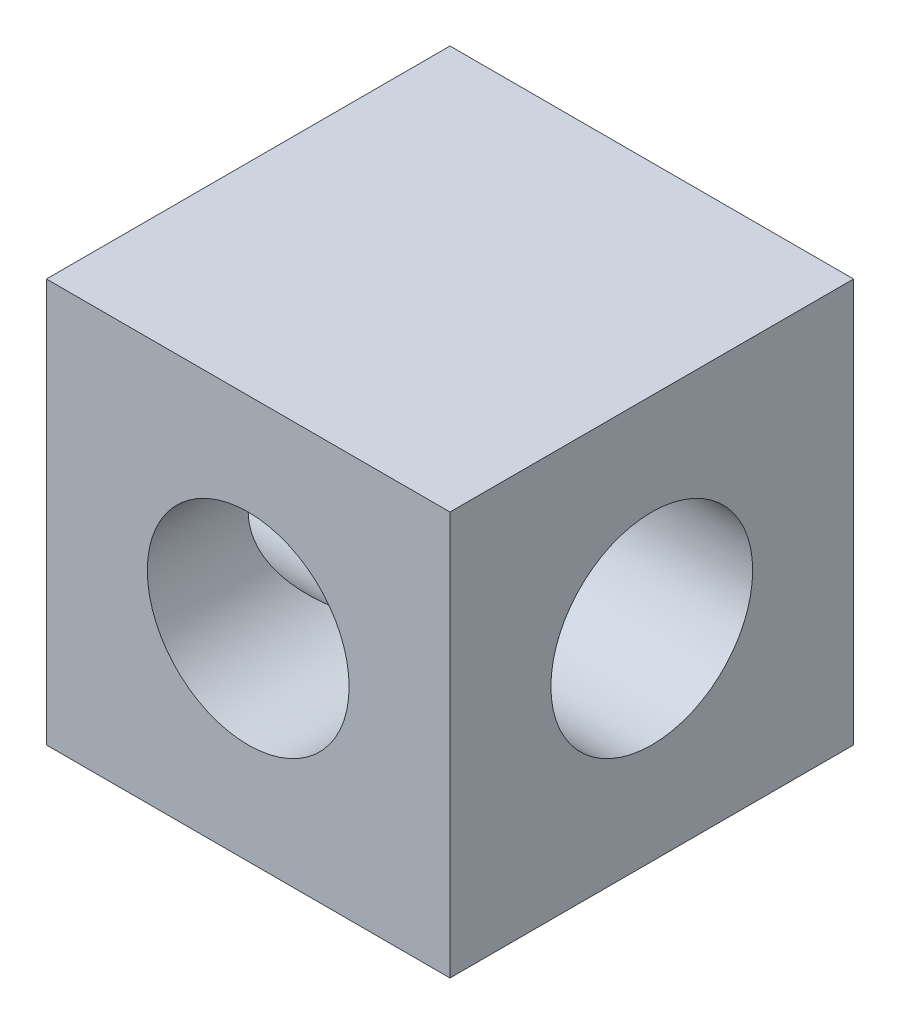
ISO-10303-21;
HEADER;
FILE_DESCRIPTION(('STEP AP214'),'2;1');
FILE_NAME('part.step','',(''),(''),'','','');
FILE_SCHEMA(('AUTOMOTIVE_DESIGN { 1 0 10303 214 1 1 1 1 }'));
ENDSEC;
DATA;
#1=APPLICATION_CONTEXT('core data for automotive mechanical design processes');
#2=APPLICATION_PROTOCOL_DEFINITION('international standard','automotive_design',2000,#1);
#3=PRODUCT_CONTEXT('',#1,'mechanical');
#4=PRODUCT('Part','Part','',(#3));
#5=PRODUCT_RELATED_PRODUCT_CATEGORY('part','',(#4));
#6=PRODUCT_DEFINITION_FORMATION('','',#4);
#7=PRODUCT_DEFINITION_CONTEXT('part definition',#1,'design');
#8=PRODUCT_DEFINITION('design','',#6,#7);
#9=PRODUCT_DEFINITION_SHAPE('','',#8);
#10=(LENGTH_UNIT() NAMED_UNIT(*) SI_UNIT(.MILLI.,.METRE.));
#11=(NAMED_UNIT(*) PLANE_ANGLE_UNIT() SI_UNIT($,.RADIAN.));
#12=(NAMED_UNIT(*) SI_UNIT($,.STERADIAN.) SOLID_ANGLE_UNIT());
#13=UNCERTAINTY_MEASURE_WITH_UNIT(LENGTH_MEASURE(1.E-05),#10,'distance_accuracy_value','');
#14=(GEOMETRIC_REPRESENTATION_CONTEXT(3) GLOBAL_UNCERTAINTY_ASSIGNED_CONTEXT((#13)) GLOBAL_UNIT_ASSIGNED_CONTEXT((#10,
#11,#12)) REPRESENTATION_CONTEXT('',''));
#15=CARTESIAN_POINT('',(0.,0.,0.));
#16=DIRECTION('',(0.,0.,1.));
#17=DIRECTION('',(1.,0.,0.));
#18=AXIS2_PLACEMENT_3D('',#15,#16,#17);
#19=CARTESIAN_POINT('',(-61.7283950617283,200.,-58.0246913580246));
#20=DIRECTION('',(1.,0.,0.));
#21=DIRECTION('',(0.,0.,-1.));
#22=AXIS2_PLACEMENT_3D('',#19,#20,#21);
#23=PLANE('',#22);
#24=CARTESIAN_POINT('',(-61.7283950617283,100.,41.9753086419754));
#25=DIRECTION('',(-1.,0.,0.));
#26=DIRECTION('',(0.,0.,1.));
#27=AXIS2_PLACEMENT_3D('',#24,#25,#26);
#28=CIRCLE('',#27,50.);
#29=CARTESIAN_POINT('',(-61.7283950617283,100.,91.9753086419754));
#30=VERTEX_POINT('',#29);
#31=EDGE_CURVE('E103',#30,#30,#28,.T.);
#32=ORIENTED_EDGE('',*,*,#31,.F.);
#33=EDGE_LOOP('',(#32));
#34=FACE_BOUND('',#33,.T.);
#35=DIRECTION('',(0.,0.,1.));
#36=VECTOR('',#35,1.);
#37=CARTESIAN_POINT('',(-61.7283950617283,0.,-58.0246913580246));
#38=LINE('',#37,#36);
#39=CARTESIAN_POINT('',(-61.7283950617283,0.,-58.0246913580246));
#40=VERTEX_POINT('',#39);
#41=CARTESIAN_POINT('',(-61.7283950617283,0.,141.975308641975));
#42=VERTEX_POINT('',#41);
#43=EDGE_CURVE('E109',#40,#42,#38,.T.);
#44=ORIENTED_EDGE('',*,*,#43,.T.);
#45=DIRECTION('',(0.,-1.,0.));
#46=VECTOR('',#45,1.);
#47=CARTESIAN_POINT('',(-61.7283950617283,200.,141.975308641975));
#48=LINE('',#47,#46);
#49=CARTESIAN_POINT('',(-61.7283950617283,200.,141.975308641975));
#50=VERTEX_POINT('',#49);
#51=EDGE_CURVE('E94',#50,#42,#48,.T.);
#52=ORIENTED_EDGE('',*,*,#51,.F.);
#53=DIRECTION('',(0.,0.,1.));
#54=VECTOR('',#53,1.);
#55=CARTESIAN_POINT('',(-61.7283950617283,200.,-58.0246913580246));
#56=LINE('',#55,#54);
#57=CARTESIAN_POINT('',(-61.7283950617283,200.,-58.0246913580246));
#58=VERTEX_POINT('',#57);
#59=EDGE_CURVE('E133',#58,#50,#56,.T.);
#60=ORIENTED_EDGE('',*,*,#59,.F.);
#61=DIRECTION('',(0.,-1.,0.));
#62=VECTOR('',#61,1.);
#63=CARTESIAN_POINT('',(-61.7283950617283,200.,-58.0246913580246));
#64=LINE('',#63,#62);
#65=EDGE_CURVE('E128',#58,#40,#64,.T.);
#66=ORIENTED_EDGE('',*,*,#65,.T.);
#67=EDGE_LOOP('',(#44,#52,#60,#66));
#68=FACE_BOUND('',#67,.T.);
#69=ADVANCED_FACE('F39',(#34,#68),#23,.F.);
#70=CARTESIAN_POINT('',(-61.7283950617283,200.,141.975308641975));
#71=DIRECTION('',(0.,0.,-1.));
#72=DIRECTION('',(-1.,0.,0.));
#73=AXIS2_PLACEMENT_3D('',#70,#71,#72);
#74=PLANE('',#73);
#75=CARTESIAN_POINT('',(38.2716049382716,100.,141.975308641975));
#76=DIRECTION('',(0.,0.,1.));
#77=DIRECTION('',(1.,0.,0.));
#78=AXIS2_PLACEMENT_3D('',#75,#76,#77);
#79=CIRCLE('',#78,50.);
#80=CARTESIAN_POINT('',(88.2716049382717,100.,141.975308641975));
#81=VERTEX_POINT('',#80);
#82=EDGE_CURVE('E116',#81,#81,#79,.T.);
#83=ORIENTED_EDGE('',*,*,#82,.F.);
#84=EDGE_LOOP('',(#83));
#85=FACE_BOUND('',#84,.T.);
#86=DIRECTION('',(1.,0.,0.));
#87=VECTOR('',#86,1.);
#88=CARTESIAN_POINT('',(-61.7283950617283,0.,141.975308641975));
#89=LINE('',#88,#87);
#90=CARTESIAN_POINT('',(138.271604938272,0.,141.975308641975));
#91=VERTEX_POINT('',#90);
#92=EDGE_CURVE('E114',#42,#91,#89,.T.);
#93=ORIENTED_EDGE('',*,*,#92,.T.);
#94=DIRECTION('',(0.,-1.,0.));
#95=VECTOR('',#94,1.);
#96=CARTESIAN_POINT('',(138.271604938272,200.,141.975308641975));
#97=LINE('',#96,#95);
#98=CARTESIAN_POINT('',(138.271604938272,200.,141.975308641975));
#99=VERTEX_POINT('',#98);
#100=EDGE_CURVE('E121',#99,#91,#97,.T.);
#101=ORIENTED_EDGE('',*,*,#100,.F.);
#102=DIRECTION('',(1.,0.,0.));
#103=VECTOR('',#102,1.);
#104=CARTESIAN_POINT('',(-61.7283950617283,200.,141.975308641975));
#105=LINE('',#104,#103);
#106=EDGE_CURVE('E89',#50,#99,#105,.T.);
#107=ORIENTED_EDGE('',*,*,#106,.F.);
#108=ORIENTED_EDGE('',*,*,#51,.T.);
#109=EDGE_LOOP('',(#93,#101,#107,#108));
#110=FACE_BOUND('',#109,.T.);
#111=ADVANCED_FACE('F153',(#85,#110),#74,.F.);
#112=CARTESIAN_POINT('',(138.271604938272,200.,-58.0246913580246));
#113=DIRECTION('',(-1.,0.,0.));
#114=DIRECTION('',(0.,0.,1.));
#115=AXIS2_PLACEMENT_3D('',#112,#113,#114);
#116=PLANE('',#115);
#117=CARTESIAN_POINT('',(138.271604938272,100.,41.9753086419753));
#118=DIRECTION('',(-1.,0.,0.));
#119=DIRECTION('',(0.,0.,1.));
#120=AXIS2_PLACEMENT_3D('',#117,#118,#119);
#121=CIRCLE('',#120,50.);
#122=CARTESIAN_POINT('',(138.271604938272,100.,91.9753086419753));
#123=VERTEX_POINT('',#122);
#124=EDGE_CURVE('E106',#123,#123,#121,.T.);
#125=ORIENTED_EDGE('',*,*,#124,.T.);
#126=EDGE_LOOP('',(#125));
#127=FACE_BOUND('',#126,.T.);
#128=DIRECTION('',(0.,0.,-1.));
#129=VECTOR('',#128,1.);
#130=CARTESIAN_POINT('',(138.271604938272,0.,-58.0246913580246));
#131=LINE('',#130,#129);
#132=CARTESIAN_POINT('',(138.271604938272,0.,-58.0246913580246));
#133=VERTEX_POINT('',#132);
#134=EDGE_CURVE('E134',#91,#133,#131,.T.);
#135=ORIENTED_EDGE('',*,*,#134,.T.);
#136=DIRECTION('',(0.,-1.,0.));
#137=VECTOR('',#136,1.);
#138=CARTESIAN_POINT('',(138.271604938272,200.,-58.0246913580246));
#139=LINE('',#138,#137);
#140=CARTESIAN_POINT('',(138.271604938272,200.,-58.0246913580246));
#141=VERTEX_POINT('',#140);
#142=EDGE_CURVE('E125',#141,#133,#139,.T.);
#143=ORIENTED_EDGE('',*,*,#142,.F.);
#144=DIRECTION('',(0.,0.,-1.));
#145=VECTOR('',#144,1.);
#146=CARTESIAN_POINT('',(138.271604938272,200.,-58.0246913580246));
#147=LINE('',#146,#145);
#148=EDGE_CURVE('E141',#99,#141,#147,.T.);
#149=ORIENTED_EDGE('',*,*,#148,.F.);
#150=ORIENTED_EDGE('',*,*,#100,.T.);
#151=EDGE_LOOP('',(#135,#143,#149,#150));
#152=FACE_BOUND('',#151,.T.);
#153=ADVANCED_FACE('F155',(#127,#152),#116,.F.);
#154=CARTESIAN_POINT('',(-61.7283950617283,200.,-58.0246913580246));
#155=DIRECTION('',(0.,0.,1.));
#156=DIRECTION('',(1.,0.,0.));
#157=AXIS2_PLACEMENT_3D('',#154,#155,#156);
#158=PLANE('',#157);
#159=DIRECTION('',(-1.,0.,0.));
#160=VECTOR('',#159,1.);
#161=CARTESIAN_POINT('',(-61.7283950617283,0.,-58.0246913580246));
#162=LINE('',#161,#160);
#163=EDGE_CURVE('E81',#133,#40,#162,.T.);
#164=ORIENTED_EDGE('',*,*,#163,.T.);
#165=ORIENTED_EDGE('',*,*,#65,.F.);
#166=DIRECTION('',(-1.,0.,0.));
#167=VECTOR('',#166,1.);
#168=CARTESIAN_POINT('',(-61.7283950617283,200.,-58.0246913580246));
#169=LINE('',#168,#167);
#170=EDGE_CURVE('E60',#141,#58,#169,.T.);
#171=ORIENTED_EDGE('',*,*,#170,.F.);
#172=ORIENTED_EDGE('',*,*,#142,.T.);
#173=EDGE_LOOP('',(#164,#165,#171,#172));
#174=FACE_BOUND('',#173,.T.);
#175=ADVANCED_FACE('F165',(#174),#158,.F.);
#176=CARTESIAN_POINT('',(0.,200.,0.));
#177=DIRECTION('',(0.,1.,0.));
#178=DIRECTION('',(0.,0.,1.));
#179=AXIS2_PLACEMENT_3D('',#176,#177,#178);
#180=PLANE('',#179);
#181=ORIENTED_EDGE('',*,*,#59,.T.);
#182=ORIENTED_EDGE('',*,*,#106,.T.);
#183=ORIENTED_EDGE('',*,*,#148,.T.);
#184=ORIENTED_EDGE('',*,*,#170,.T.);
#185=EDGE_LOOP('',(#181,#182,#183,#184));
#186=FACE_BOUND('',#185,.T.);
#187=ADVANCED_FACE('F167',(#186),#180,.T.);
#188=CARTESIAN_POINT('',(0.,0.,0.));
#189=DIRECTION('',(0.,1.,0.));
#190=DIRECTION('',(0.,0.,1.));
#191=AXIS2_PLACEMENT_3D('',#188,#189,#190);
#192=PLANE('',#191);
#193=ORIENTED_EDGE('',*,*,#43,.F.);
#194=ORIENTED_EDGE('',*,*,#163,.F.);
#195=ORIENTED_EDGE('',*,*,#134,.F.);
#196=ORIENTED_EDGE('',*,*,#92,.F.);
#197=EDGE_LOOP('',(#193,#194,#195,#196));
#198=FACE_BOUND('',#197,.T.);
#199=ADVANCED_FACE('F98',(#198),#192,.F.);
#200=CARTESIAN_POINT('',(148.271604938272,100.,41.9753086419753));
#201=DIRECTION('',(-1.,0.,0.));
#202=DIRECTION('',(0.,0.,1.));
#203=AXIS2_PLACEMENT_3D('',#200,#201,#202);
#204=CYLINDRICAL_SURFACE('',#203,50.);
#205=CARTESIAN_POINT('',(38.2716049382716,100.,41.9753086419754));
#206=DIRECTION('',(-0.707106781186548,0.,-0.707106781186547));
#207=DIRECTION('',(-0.707106781186547,0.,0.707106781186548));
#208=AXIS2_PLACEMENT_3D('',#205,#206,#207);
#209=ELLIPSE('',#208,70.7106781186548,50.);
#210=CARTESIAN_POINT('',(38.2716049382716,150.,41.9753086419754));
#211=VERTEX_POINT('',#210);
#212=CARTESIAN_POINT('',(38.2716049382716,50.,41.9753086419754));
#213=VERTEX_POINT('',#212);
#214=EDGE_CURVE('E47',#211,#213,#209,.F.);
#215=ORIENTED_EDGE('',*,*,#214,.T.);
#216=CARTESIAN_POINT('',(38.2716049382716,100.,41.9753086419754));
#217=DIRECTION('',(-0.707106781186547,0.,0.707106781186548));
#218=DIRECTION('',(-0.707106781186548,0.,-0.707106781186547));
#219=AXIS2_PLACEMENT_3D('',#216,#217,#218);
#220=ELLIPSE('',#219,70.7106781186548,50.);
#221=EDGE_CURVE('E11',#213,#211,#220,.T.);
#222=ORIENTED_EDGE('',*,*,#221,.T.);
#223=EDGE_LOOP('',(#215,#222));
#224=FACE_BOUND('',#223,.T.);
#225=ORIENTED_EDGE('',*,*,#31,.T.);
#226=EDGE_LOOP('',(#225));
#227=FACE_BOUND('',#226,.T.);
#228=ORIENTED_EDGE('',*,*,#124,.F.);
#229=EDGE_LOOP('',(#228));
#230=FACE_BOUND('',#229,.T.);
#231=ADVANCED_FACE('F95',(#224,#227,#230),#204,.F.);
#232=CARTESIAN_POINT('',(38.2716049382716,100.,41.9753086419754));
#233=DIRECTION('',(0.,0.,1.));
#234=DIRECTION('',(1.,0.,0.));
#235=AXIS2_PLACEMENT_3D('',#232,#233,#234);
#236=CYLINDRICAL_SURFACE('',#235,50.);
#237=ORIENTED_EDGE('',*,*,#82,.T.);
#238=EDGE_LOOP('',(#237));
#239=FACE_BOUND('',#238,.T.);
#240=ORIENTED_EDGE('',*,*,#214,.F.);
#241=ORIENTED_EDGE('',*,*,#221,.F.);
#242=EDGE_LOOP('',(#240,#241));
#243=FACE_BOUND('',#242,.T.);
#244=ADVANCED_FACE('F91',(#239,#243),#236,.F.);
#245=CLOSED_SHELL('',(#69,#111,#153,#175,#187,#199,#231,#244));
#246=MANIFOLD_SOLID_BREP('B2',#245);
#247=ADVANCED_BREP_SHAPE_REPRESENTATION('',(#18,#246),#14);
#248=SHAPE_DEFINITION_REPRESENTATION(#9,#247);
ENDSEC;
END-ISO-10303-21;
